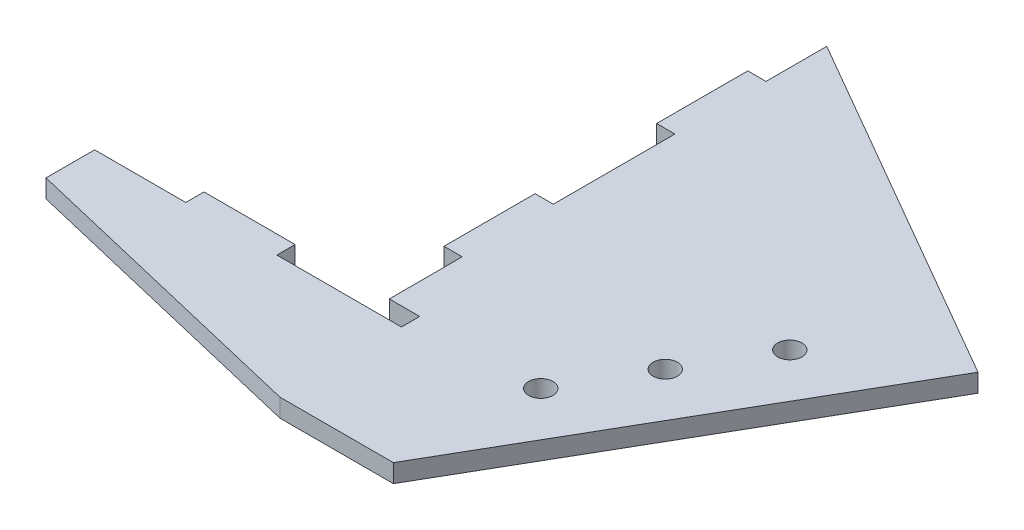
ISO-10303-21;
HEADER;
FILE_DESCRIPTION(('STEP AP214'),'2;1');
FILE_NAME('part.step','',(''),(''),'','','');
FILE_SCHEMA(('AUTOMOTIVE_DESIGN { 1 0 10303 214 1 1 1 1 }'));
ENDSEC;
DATA;
#1=APPLICATION_CONTEXT('core data for automotive mechanical design processes');
#2=APPLICATION_PROTOCOL_DEFINITION('international standard','automotive_design',2000,#1);
#3=PRODUCT_CONTEXT('',#1,'mechanical');
#4=PRODUCT('Part','Part','',(#3));
#5=PRODUCT_RELATED_PRODUCT_CATEGORY('part','',(#4));
#6=PRODUCT_DEFINITION_FORMATION('','',#4);
#7=PRODUCT_DEFINITION_CONTEXT('part definition',#1,'design');
#8=PRODUCT_DEFINITION('design','',#6,#7);
#9=PRODUCT_DEFINITION_SHAPE('','',#8);
#10=(LENGTH_UNIT() NAMED_UNIT(*) SI_UNIT(.MILLI.,.METRE.));
#11=(NAMED_UNIT(*) PLANE_ANGLE_UNIT() SI_UNIT($,.RADIAN.));
#12=(NAMED_UNIT(*) SI_UNIT($,.STERADIAN.) SOLID_ANGLE_UNIT());
#13=UNCERTAINTY_MEASURE_WITH_UNIT(LENGTH_MEASURE(1.E-05),#10,'distance_accuracy_value','');
#14=(GEOMETRIC_REPRESENTATION_CONTEXT(3) GLOBAL_UNCERTAINTY_ASSIGNED_CONTEXT((#13)) GLOBAL_UNIT_ASSIGNED_CONTEXT((#10,
#11,#12)) REPRESENTATION_CONTEXT('',''));
#15=CARTESIAN_POINT('',(0.,0.,0.));
#16=DIRECTION('',(0.,0.,1.));
#17=DIRECTION('',(1.,0.,0.));
#18=AXIS2_PLACEMENT_3D('',#15,#16,#17);
#19=CARTESIAN_POINT('',(-3.33933376635427,3.,14.0530296000742));
#20=DIRECTION('',(0.231186409592624,0.,-0.972909473702292));
#21=DIRECTION('',(-0.972909473702292,0.,-0.231186409592624));
#22=AXIS2_PLACEMENT_3D('',#19,#20,#21);
#23=PLANE('',#22);
#24=DIRECTION('',(0.972909473702292,0.,0.231186409592624));
#25=VECTOR('',#24,1.);
#26=CARTESIAN_POINT('',(-3.33933376635427,0.,14.0530296000742));
#27=LINE('',#26,#25);
#28=CARTESIAN_POINT('',(-22.5,0.,9.5));
#29=VERTEX_POINT('',#28);
#30=CARTESIAN_POINT('',(28.,0.,21.5));
#31=VERTEX_POINT('',#30);
#32=EDGE_CURVE('E277',#29,#31,#27,.T.);
#33=ORIENTED_EDGE('',*,*,#32,.T.);
#34=DIRECTION('',(0.,-1.,0.));
#35=VECTOR('',#34,1.);
#36=CARTESIAN_POINT('',(28.,3.,21.5));
#37=LINE('',#36,#35);
#38=CARTESIAN_POINT('',(28.,3.,21.5));
#39=VERTEX_POINT('',#38);
#40=EDGE_CURVE('E11',#39,#31,#37,.T.);
#41=ORIENTED_EDGE('',*,*,#40,.F.);
#42=DIRECTION('',(0.972909473702292,0.,0.231186409592624));
#43=VECTOR('',#42,1.);
#44=CARTESIAN_POINT('',(-3.33933376635427,3.,14.0530296000742));
#45=LINE('',#44,#43);
#46=CARTESIAN_POINT('',(-22.5,3.,9.5));
#47=VERTEX_POINT('',#46);
#48=EDGE_CURVE('E138',#47,#39,#45,.T.);
#49=ORIENTED_EDGE('',*,*,#48,.F.);
#50=DIRECTION('',(0.,-1.,0.));
#51=VECTOR('',#50,1.);
#52=CARTESIAN_POINT('',(-22.5,3.,9.5));
#53=LINE('',#52,#51);
#54=EDGE_CURVE('E213',#47,#29,#53,.T.);
#55=ORIENTED_EDGE('',*,*,#54,.T.);
#56=EDGE_LOOP('',(#33,#41,#49,#55));
#57=FACE_BOUND('',#56,.T.);
#58=ADVANCED_FACE('F43',(#57),#23,.F.);
#59=CARTESIAN_POINT('',(0.,3.,21.5));
#60=DIRECTION('',(0.,0.,1.));
#61=DIRECTION('',(1.,0.,0.));
#62=AXIS2_PLACEMENT_3D('',#59,#60,#61);
#63=PLANE('',#62);
#64=DIRECTION('',(-1.,0.,0.));
#65=VECTOR('',#64,1.);
#66=CARTESIAN_POINT('',(0.,0.,21.5));
#67=LINE('',#66,#65);
#68=CARTESIAN_POINT('',(46.6713610367752,0.,21.5));
#69=VERTEX_POINT('',#68);
#70=EDGE_CURVE('E281',#69,#31,#67,.T.);
#71=ORIENTED_EDGE('',*,*,#70,.F.);
#72=DIRECTION('',(0.,-1.,0.));
#73=VECTOR('',#72,1.);
#74=CARTESIAN_POINT('',(46.6713610367752,3.,21.5));
#75=LINE('',#74,#73);
#76=CARTESIAN_POINT('',(46.6713610367752,3.,21.5));
#77=VERTEX_POINT('',#76);
#78=EDGE_CURVE('E51',#77,#69,#75,.T.);
#79=ORIENTED_EDGE('',*,*,#78,.F.);
#80=DIRECTION('',(-1.,0.,0.));
#81=VECTOR('',#80,1.);
#82=CARTESIAN_POINT('',(0.,3.,21.5));
#83=LINE('',#82,#81);
#84=EDGE_CURVE('E256',#77,#39,#83,.T.);
#85=ORIENTED_EDGE('',*,*,#84,.T.);
#86=ORIENTED_EDGE('',*,*,#40,.T.);
#87=EDGE_LOOP('',(#71,#79,#85,#86));
#88=FACE_BOUND('',#87,.T.);
#89=ADVANCED_FACE('F372',(#88),#63,.T.);
#90=CARTESIAN_POINT('',(44.3132938682643,3.,25.584292143521));
#91=DIRECTION('',(0.866025403784442,0.,0.499999999999994));
#92=DIRECTION('',(0.499999999999995,0.,-0.866025403784442));
#93=AXIS2_PLACEMENT_3D('',#90,#91,#92);
#94=PLANE('',#93);
#95=DIRECTION('',(-0.499999999999995,0.,0.866025403784442));
#96=VECTOR('',#95,1.);
#97=CARTESIAN_POINT('',(44.3132938682643,0.,25.584292143521));
#98=LINE('',#97,#96);
#99=CARTESIAN_POINT('',(81.889727457342,0.,-39.5000000000003));
#100=VERTEX_POINT('',#99);
#101=EDGE_CURVE('E286',#100,#69,#98,.T.);
#102=ORIENTED_EDGE('',*,*,#101,.F.);
#103=DIRECTION('',(0.,-1.,0.));
#104=VECTOR('',#103,1.);
#105=CARTESIAN_POINT('',(81.889727457342,3.,-39.5000000000003));
#106=LINE('',#105,#104);
#107=CARTESIAN_POINT('',(81.889727457342,3.,-39.5000000000003));
#108=VERTEX_POINT('',#107);
#109=EDGE_CURVE('E365',#108,#100,#106,.T.);
#110=ORIENTED_EDGE('',*,*,#109,.F.);
#111=DIRECTION('',(-0.499999999999995,0.,0.866025403784442));
#112=VECTOR('',#111,1.);
#113=CARTESIAN_POINT('',(44.3132938682643,3.,25.584292143521));
#114=LINE('',#113,#112);
#115=EDGE_CURVE('E253',#108,#77,#114,.T.);
#116=ORIENTED_EDGE('',*,*,#115,.T.);
#117=ORIENTED_EDGE('',*,*,#78,.T.);
#118=EDGE_LOOP('',(#102,#110,#116,#117));
#119=FACE_BOUND('',#118,.T.);
#120=ADVANCED_FACE('F369',(#119),#94,.T.);
#121=CARTESIAN_POINT('',(37.5764335890778,3.,-65.0842921435214));
#122=DIRECTION('',(0.499999999999995,0.,-0.866025403784442));
#123=DIRECTION('',(-0.866025403784442,0.,-0.499999999999995));
#124=AXIS2_PLACEMENT_3D('',#121,#122,#123);
#125=PLANE('',#124);
#126=DIRECTION('',(0.866025403784442,0.,0.499999999999995));
#127=VECTOR('',#126,1.);
#128=CARTESIAN_POINT('',(37.5764335890778,0.,-65.0842921435214));
#129=LINE('',#128,#127);
#130=CARTESIAN_POINT('',(23.,0.,-73.5));
#131=VERTEX_POINT('',#130);
#132=EDGE_CURVE('E291',#131,#100,#129,.T.);
#133=ORIENTED_EDGE('',*,*,#132,.F.);
#134=DIRECTION('',(0.,-1.,0.));
#135=VECTOR('',#134,1.);
#136=CARTESIAN_POINT('',(23.,3.,-73.5));
#137=LINE('',#136,#135);
#138=CARTESIAN_POINT('',(23.,3.,-73.5));
#139=VERTEX_POINT('',#138);
#140=EDGE_CURVE('E363',#139,#131,#137,.T.);
#141=ORIENTED_EDGE('',*,*,#140,.F.);
#142=DIRECTION('',(0.866025403784442,0.,0.499999999999995));
#143=VECTOR('',#142,1.);
#144=CARTESIAN_POINT('',(37.5764335890778,3.,-65.0842921435214));
#145=LINE('',#144,#143);
#146=EDGE_CURVE('E250',#139,#108,#145,.T.);
#147=ORIENTED_EDGE('',*,*,#146,.T.);
#148=ORIENTED_EDGE('',*,*,#109,.T.);
#149=EDGE_LOOP('',(#133,#141,#147,#148));
#150=FACE_BOUND('',#149,.T.);
#151=ADVANCED_FACE('F379',(#150),#125,.T.);
#152=CARTESIAN_POINT('',(23.,3.,0.));
#153=DIRECTION('',(-1.,0.,0.));
#154=DIRECTION('',(0.,0.,1.));
#155=AXIS2_PLACEMENT_3D('',#152,#153,#154);
#156=PLANE('',#155);
#157=DIRECTION('',(0.,0.,-1.));
#158=VECTOR('',#157,1.);
#159=CARTESIAN_POINT('',(23.,0.,0.));
#160=LINE('',#159,#158);
#161=CARTESIAN_POINT('',(23.,0.,-63.5));
#162=VERTEX_POINT('',#161);
#163=EDGE_CURVE('E294',#162,#131,#160,.T.);
#164=ORIENTED_EDGE('',*,*,#163,.F.);
#165=DIRECTION('',(0.,-1.,0.));
#166=VECTOR('',#165,1.);
#167=CARTESIAN_POINT('',(23.,3.,-63.5));
#168=LINE('',#167,#166);
#169=CARTESIAN_POINT('',(23.,3.,-63.5));
#170=VERTEX_POINT('',#169);
#171=EDGE_CURVE('E361',#170,#162,#168,.T.);
#172=ORIENTED_EDGE('',*,*,#171,.F.);
#173=DIRECTION('',(0.,0.,-1.));
#174=VECTOR('',#173,1.);
#175=CARTESIAN_POINT('',(23.,3.,0.));
#176=LINE('',#175,#174);
#177=EDGE_CURVE('E247',#170,#139,#176,.T.);
#178=ORIENTED_EDGE('',*,*,#177,.T.);
#179=ORIENTED_EDGE('',*,*,#140,.T.);
#180=EDGE_LOOP('',(#164,#172,#178,#179));
#181=FACE_BOUND('',#180,.T.);
#182=ADVANCED_FACE('F383',(#181),#156,.T.);
#183=CARTESIAN_POINT('',(0.,3.,-63.5));
#184=DIRECTION('',(0.,0.,1.));
#185=DIRECTION('',(1.,0.,0.));
#186=AXIS2_PLACEMENT_3D('',#183,#184,#185);
#187=PLANE('',#186);
#188=DIRECTION('',(-1.,0.,0.));
#189=VECTOR('',#188,1.);
#190=CARTESIAN_POINT('',(0.,0.,-63.5));
#191=LINE('',#190,#189);
#192=CARTESIAN_POINT('',(20.,0.,-63.5));
#193=VERTEX_POINT('',#192);
#194=EDGE_CURVE('E297',#162,#193,#191,.T.);
#195=ORIENTED_EDGE('',*,*,#194,.T.);
#196=DIRECTION('',(0.,-1.,0.));
#197=VECTOR('',#196,1.);
#198=CARTESIAN_POINT('',(20.,3.,-63.5));
#199=LINE('',#198,#197);
#200=CARTESIAN_POINT('',(20.,3.,-63.5));
#201=VERTEX_POINT('',#200);
#202=EDGE_CURVE('E359',#201,#193,#199,.T.);
#203=ORIENTED_EDGE('',*,*,#202,.F.);
#204=DIRECTION('',(-1.,0.,0.));
#205=VECTOR('',#204,1.);
#206=CARTESIAN_POINT('',(0.,3.,-63.5));
#207=LINE('',#206,#205);
#208=EDGE_CURVE('E245',#170,#201,#207,.T.);
#209=ORIENTED_EDGE('',*,*,#208,.F.);
#210=ORIENTED_EDGE('',*,*,#171,.T.);
#211=EDGE_LOOP('',(#195,#203,#209,#210));
#212=FACE_BOUND('',#211,.T.);
#213=ADVANCED_FACE('F387',(#212),#187,.F.);
#214=CARTESIAN_POINT('',(20.,3.,0.));
#215=DIRECTION('',(-1.,0.,0.));
#216=DIRECTION('',(0.,0.,1.));
#217=AXIS2_PLACEMENT_3D('',#214,#215,#216);
#218=PLANE('',#217);
#219=DIRECTION('',(0.,0.,-1.));
#220=VECTOR('',#219,1.);
#221=CARTESIAN_POINT('',(20.,0.,0.));
#222=LINE('',#221,#220);
#223=CARTESIAN_POINT('',(20.,0.,-48.5));
#224=VERTEX_POINT('',#223);
#225=EDGE_CURVE('E302',#224,#193,#222,.T.);
#226=ORIENTED_EDGE('',*,*,#225,.F.);
#227=DIRECTION('',(0.,-1.,0.));
#228=VECTOR('',#227,1.);
#229=CARTESIAN_POINT('',(20.,3.,-48.5));
#230=LINE('',#229,#228);
#231=CARTESIAN_POINT('',(20.,3.,-48.5));
#232=VERTEX_POINT('',#231);
#233=EDGE_CURVE('E357',#232,#224,#230,.T.);
#234=ORIENTED_EDGE('',*,*,#233,.F.);
#235=DIRECTION('',(0.,0.,-1.));
#236=VECTOR('',#235,1.);
#237=CARTESIAN_POINT('',(20.,3.,0.));
#238=LINE('',#237,#236);
#239=EDGE_CURVE('E242',#232,#201,#238,.T.);
#240=ORIENTED_EDGE('',*,*,#239,.T.);
#241=ORIENTED_EDGE('',*,*,#202,.T.);
#242=EDGE_LOOP('',(#226,#234,#240,#241));
#243=FACE_BOUND('',#242,.T.);
#244=ADVANCED_FACE('F448',(#243),#218,.T.);
#245=CARTESIAN_POINT('',(0.,3.,-48.5));
#246=DIRECTION('',(0.,0.,1.));
#247=DIRECTION('',(1.,0.,0.));
#248=AXIS2_PLACEMENT_3D('',#245,#246,#247);
#249=PLANE('',#248);
#250=DIRECTION('',(-1.,0.,0.));
#251=VECTOR('',#250,1.);
#252=CARTESIAN_POINT('',(0.,0.,-48.5));
#253=LINE('',#252,#251);
#254=CARTESIAN_POINT('',(23.,0.,-48.5));
#255=VERTEX_POINT('',#254);
#256=EDGE_CURVE('E305',#255,#224,#253,.T.);
#257=ORIENTED_EDGE('',*,*,#256,.F.);
#258=DIRECTION('',(0.,-1.,0.));
#259=VECTOR('',#258,1.);
#260=CARTESIAN_POINT('',(23.,3.,-48.5));
#261=LINE('',#260,#259);
#262=CARTESIAN_POINT('',(23.,3.,-48.5));
#263=VERTEX_POINT('',#262);
#264=EDGE_CURVE('E355',#263,#255,#261,.T.);
#265=ORIENTED_EDGE('',*,*,#264,.F.);
#266=DIRECTION('',(-1.,0.,0.));
#267=VECTOR('',#266,1.);
#268=CARTESIAN_POINT('',(0.,3.,-48.5));
#269=LINE('',#268,#267);
#270=EDGE_CURVE('E239',#263,#232,#269,.T.);
#271=ORIENTED_EDGE('',*,*,#270,.T.);
#272=ORIENTED_EDGE('',*,*,#233,.T.);
#273=EDGE_LOOP('',(#257,#265,#271,#272));
#274=FACE_BOUND('',#273,.T.);
#275=ADVANCED_FACE('F395',(#274),#249,.T.);
#276=CARTESIAN_POINT('',(23.,0.,-28.5));
#277=VERTEX_POINT('',#276);
#278=EDGE_CURVE('E299',#277,#255,#160,.T.);
#279=ORIENTED_EDGE('',*,*,#278,.F.);
#280=DIRECTION('',(0.,-1.,0.));
#281=VECTOR('',#280,1.);
#282=CARTESIAN_POINT('',(23.,3.,-28.5));
#283=LINE('',#282,#281);
#284=CARTESIAN_POINT('',(23.,3.,-28.5));
#285=VERTEX_POINT('',#284);
#286=EDGE_CURVE('E353',#285,#277,#283,.T.);
#287=ORIENTED_EDGE('',*,*,#286,.F.);
#288=EDGE_CURVE('E238',#285,#263,#176,.T.);
#289=ORIENTED_EDGE('',*,*,#288,.T.);
#290=ORIENTED_EDGE('',*,*,#264,.T.);
#291=EDGE_LOOP('',(#279,#287,#289,#290));
#292=FACE_BOUND('',#291,.T.);
#293=ADVANCED_FACE('F400',(#292),#156,.T.);
#294=CARTESIAN_POINT('',(0.,3.,-28.5));
#295=DIRECTION('',(0.,0.,1.));
#296=DIRECTION('',(1.,0.,0.));
#297=AXIS2_PLACEMENT_3D('',#294,#295,#296);
#298=PLANE('',#297);
#299=DIRECTION('',(-1.,0.,0.));
#300=VECTOR('',#299,1.);
#301=CARTESIAN_POINT('',(0.,0.,-28.5));
#302=LINE('',#301,#300);
#303=CARTESIAN_POINT('',(20.,0.,-28.5));
#304=VERTEX_POINT('',#303);
#305=EDGE_CURVE('E308',#277,#304,#302,.T.);
#306=ORIENTED_EDGE('',*,*,#305,.T.);
#307=DIRECTION('',(0.,-1.,0.));
#308=VECTOR('',#307,1.);
#309=CARTESIAN_POINT('',(20.,3.,-28.5));
#310=LINE('',#309,#308);
#311=CARTESIAN_POINT('',(20.,3.,-28.5));
#312=VERTEX_POINT('',#311);
#313=EDGE_CURVE('E351',#312,#304,#310,.T.);
#314=ORIENTED_EDGE('',*,*,#313,.F.);
#315=DIRECTION('',(-1.,0.,0.));
#316=VECTOR('',#315,1.);
#317=CARTESIAN_POINT('',(0.,3.,-28.5));
#318=LINE('',#317,#316);
#319=EDGE_CURVE('E236',#285,#312,#318,.T.);
#320=ORIENTED_EDGE('',*,*,#319,.F.);
#321=ORIENTED_EDGE('',*,*,#286,.T.);
#322=EDGE_LOOP('',(#306,#314,#320,#321));
#323=FACE_BOUND('',#322,.T.);
#324=ADVANCED_FACE('F453',(#323),#298,.F.);
#325=CARTESIAN_POINT('',(20.,3.,0.));
#326=DIRECTION('',(-1.,0.,0.));
#327=DIRECTION('',(0.,0.,1.));
#328=AXIS2_PLACEMENT_3D('',#325,#326,#327);
#329=PLANE('',#328);
#330=DIRECTION('',(0.,0.,-1.));
#331=VECTOR('',#330,1.);
#332=CARTESIAN_POINT('',(20.,0.,0.));
#333=LINE('',#332,#331);
#334=CARTESIAN_POINT('',(20.,0.,-13.5));
#335=VERTEX_POINT('',#334);
#336=EDGE_CURVE('E311',#335,#304,#333,.T.);
#337=ORIENTED_EDGE('',*,*,#336,.F.);
#338=DIRECTION('',(0.,-1.,0.));
#339=VECTOR('',#338,1.);
#340=CARTESIAN_POINT('',(20.,3.,-13.5));
#341=LINE('',#340,#339);
#342=CARTESIAN_POINT('',(20.,3.,-13.5));
#343=VERTEX_POINT('',#342);
#344=EDGE_CURVE('E349',#343,#335,#341,.T.);
#345=ORIENTED_EDGE('',*,*,#344,.F.);
#346=DIRECTION('',(0.,0.,-1.));
#347=VECTOR('',#346,1.);
#348=CARTESIAN_POINT('',(20.,3.,0.));
#349=LINE('',#348,#347);
#350=EDGE_CURVE('E233',#343,#312,#349,.T.);
#351=ORIENTED_EDGE('',*,*,#350,.T.);
#352=ORIENTED_EDGE('',*,*,#313,.T.);
#353=EDGE_LOOP('',(#337,#345,#351,#352));
#354=FACE_BOUND('',#353,.T.);
#355=ADVANCED_FACE('F456',(#354),#329,.T.);
#356=CARTESIAN_POINT('',(0.,3.,-13.5));
#357=DIRECTION('',(0.,0.,1.));
#358=DIRECTION('',(1.,0.,0.));
#359=AXIS2_PLACEMENT_3D('',#356,#357,#358);
#360=PLANE('',#359);
#361=DIRECTION('',(-1.,0.,0.));
#362=VECTOR('',#361,1.);
#363=CARTESIAN_POINT('',(0.,0.,-13.5));
#364=LINE('',#363,#362);
#365=CARTESIAN_POINT('',(23.,0.,-13.5));
#366=VERTEX_POINT('',#365);
#367=EDGE_CURVE('E314',#366,#335,#364,.T.);
#368=ORIENTED_EDGE('',*,*,#367,.F.);
#369=DIRECTION('',(0.,-1.,0.));
#370=VECTOR('',#369,1.);
#371=CARTESIAN_POINT('',(23.,3.,-13.5));
#372=LINE('',#371,#370);
#373=CARTESIAN_POINT('',(23.,3.,-13.5));
#374=VERTEX_POINT('',#373);
#375=EDGE_CURVE('E347',#374,#366,#372,.T.);
#376=ORIENTED_EDGE('',*,*,#375,.F.);
#377=DIRECTION('',(-1.,0.,0.));
#378=VECTOR('',#377,1.);
#379=CARTESIAN_POINT('',(0.,3.,-13.5));
#380=LINE('',#379,#378);
#381=EDGE_CURVE('E230',#374,#343,#380,.T.);
#382=ORIENTED_EDGE('',*,*,#381,.T.);
#383=ORIENTED_EDGE('',*,*,#344,.T.);
#384=EDGE_LOOP('',(#368,#376,#382,#383));
#385=FACE_BOUND('',#384,.T.);
#386=ADVANCED_FACE('F460',(#385),#360,.T.);
#387=CARTESIAN_POINT('',(23.,0.,-1.5));
#388=VERTEX_POINT('',#387);
#389=EDGE_CURVE('E298',#388,#366,#160,.T.);
#390=ORIENTED_EDGE('',*,*,#389,.F.);
#391=DIRECTION('',(0.,-1.,0.));
#392=VECTOR('',#391,1.);
#393=CARTESIAN_POINT('',(23.,3.,-1.5));
#394=LINE('',#393,#392);
#395=CARTESIAN_POINT('',(23.,3.,-1.5));
#396=VERTEX_POINT('',#395);
#397=EDGE_CURVE('E345',#396,#388,#394,.T.);
#398=ORIENTED_EDGE('',*,*,#397,.F.);
#399=EDGE_CURVE('E227',#396,#374,#176,.T.);
#400=ORIENTED_EDGE('',*,*,#399,.T.);
#401=ORIENTED_EDGE('',*,*,#375,.T.);
#402=EDGE_LOOP('',(#390,#398,#400,#401));
#403=FACE_BOUND('',#402,.T.);
#404=ADVANCED_FACE('F406',(#403),#156,.T.);
#405=CARTESIAN_POINT('',(0.,3.,-1.5));
#406=DIRECTION('',(0.,0.,1.));
#407=DIRECTION('',(1.,0.,0.));
#408=AXIS2_PLACEMENT_3D('',#405,#406,#407);
#409=PLANE('',#408);
#410=DIRECTION('',(-1.,0.,0.));
#411=VECTOR('',#410,1.);
#412=CARTESIAN_POINT('',(0.,0.,-1.5));
#413=LINE('',#412,#411);
#414=CARTESIAN_POINT('',(28.,0.,-1.5));
#415=VERTEX_POINT('',#414);
#416=EDGE_CURVE('E317',#415,#388,#413,.T.);
#417=ORIENTED_EDGE('',*,*,#416,.F.);
#418=DIRECTION('',(0.,-1.,0.));
#419=VECTOR('',#418,1.);
#420=CARTESIAN_POINT('',(28.,3.,-1.5));
#421=LINE('',#420,#419);
#422=CARTESIAN_POINT('',(28.,3.,-1.5));
#423=VERTEX_POINT('',#422);
#424=EDGE_CURVE('E343',#423,#415,#421,.T.);
#425=ORIENTED_EDGE('',*,*,#424,.F.);
#426=DIRECTION('',(-1.,0.,0.));
#427=VECTOR('',#426,1.);
#428=CARTESIAN_POINT('',(0.,3.,-1.5));
#429=LINE('',#428,#427);
#430=EDGE_CURVE('E224',#423,#396,#429,.T.);
#431=ORIENTED_EDGE('',*,*,#430,.T.);
#432=ORIENTED_EDGE('',*,*,#397,.T.);
#433=EDGE_LOOP('',(#417,#425,#431,#432));
#434=FACE_BOUND('',#433,.T.);
#435=ADVANCED_FACE('F413',(#434),#409,.T.);
#436=CARTESIAN_POINT('',(28.,3.,0.));
#437=DIRECTION('',(-1.,0.,0.));
#438=DIRECTION('',(0.,0.,1.));
#439=AXIS2_PLACEMENT_3D('',#436,#437,#438);
#440=PLANE('',#439);
#441=DIRECTION('',(0.,0.,-1.));
#442=VECTOR('',#441,1.);
#443=CARTESIAN_POINT('',(28.,0.,0.));
#444=LINE('',#443,#442);
#445=CARTESIAN_POINT('',(28.,0.,1.5));
#446=VERTEX_POINT('',#445);
#447=EDGE_CURVE('E320',#446,#415,#444,.T.);
#448=ORIENTED_EDGE('',*,*,#447,.F.);
#449=DIRECTION('',(0.,-1.,0.));
#450=VECTOR('',#449,1.);
#451=CARTESIAN_POINT('',(28.,3.,1.5));
#452=LINE('',#451,#450);
#453=CARTESIAN_POINT('',(28.,3.,1.5));
#454=VERTEX_POINT('',#453);
#455=EDGE_CURVE('E341',#454,#446,#452,.T.);
#456=ORIENTED_EDGE('',*,*,#455,.F.);
#457=DIRECTION('',(0.,0.,-1.));
#458=VECTOR('',#457,1.);
#459=CARTESIAN_POINT('',(28.,3.,0.));
#460=LINE('',#459,#458);
#461=EDGE_CURVE('E218',#454,#423,#460,.T.);
#462=ORIENTED_EDGE('',*,*,#461,.T.);
#463=ORIENTED_EDGE('',*,*,#424,.T.);
#464=EDGE_LOOP('',(#448,#456,#462,#463));
#465=FACE_BOUND('',#464,.T.);
#466=ADVANCED_FACE('F415',(#465),#440,.T.);
#467=CARTESIAN_POINT('',(0.,3.,1.5));
#468=DIRECTION('',(0.,0.,1.));
#469=DIRECTION('',(1.,0.,0.));
#470=AXIS2_PLACEMENT_3D('',#467,#468,#469);
#471=PLANE('',#470);
#472=DIRECTION('',(-1.,0.,0.));
#473=VECTOR('',#472,1.);
#474=CARTESIAN_POINT('',(0.,0.,1.5));
#475=LINE('',#474,#473);
#476=CARTESIAN_POINT('',(7.5,0.,1.5));
#477=VERTEX_POINT('',#476);
#478=EDGE_CURVE('E323',#446,#477,#475,.T.);
#479=ORIENTED_EDGE('',*,*,#478,.T.);
#480=DIRECTION('',(0.,-1.,0.));
#481=VECTOR('',#480,1.);
#482=CARTESIAN_POINT('',(7.5,3.,1.5));
#483=LINE('',#482,#481);
#484=CARTESIAN_POINT('',(7.5,3.,1.5));
#485=VERTEX_POINT('',#484);
#486=EDGE_CURVE('E339',#485,#477,#483,.T.);
#487=ORIENTED_EDGE('',*,*,#486,.F.);
#488=DIRECTION('',(-1.,0.,0.));
#489=VECTOR('',#488,1.);
#490=CARTESIAN_POINT('',(0.,3.,1.5));
#491=LINE('',#490,#489);
#492=EDGE_CURVE('E212',#454,#485,#491,.T.);
#493=ORIENTED_EDGE('',*,*,#492,.F.);
#494=ORIENTED_EDGE('',*,*,#455,.T.);
#495=EDGE_LOOP('',(#479,#487,#493,#494));
#496=FACE_BOUND('',#495,.T.);
#497=ADVANCED_FACE('F420',(#496),#471,.F.);
#498=CARTESIAN_POINT('',(7.5,3.,0.));
#499=DIRECTION('',(1.,0.,0.));
#500=DIRECTION('',(0.,0.,-1.));
#501=AXIS2_PLACEMENT_3D('',#498,#499,#500);
#502=PLANE('',#501);
#503=DIRECTION('',(0.,0.,1.));
#504=VECTOR('',#503,1.);
#505=CARTESIAN_POINT('',(7.5,0.,0.));
#506=LINE('',#505,#504);
#507=CARTESIAN_POINT('',(7.5,0.,-1.5));
#508=VERTEX_POINT('',#507);
#509=EDGE_CURVE('E326',#508,#477,#506,.T.);
#510=ORIENTED_EDGE('',*,*,#509,.F.);
#511=DIRECTION('',(0.,-1.,0.));
#512=VECTOR('',#511,1.);
#513=CARTESIAN_POINT('',(7.5,3.,-1.5));
#514=LINE('',#513,#512);
#515=CARTESIAN_POINT('',(7.5,3.,-1.5));
#516=VERTEX_POINT('',#515);
#517=EDGE_CURVE('E337',#516,#508,#514,.T.);
#518=ORIENTED_EDGE('',*,*,#517,.F.);
#519=DIRECTION('',(0.,0.,1.));
#520=VECTOR('',#519,1.);
#521=CARTESIAN_POINT('',(7.5,3.,0.));
#522=LINE('',#521,#520);
#523=EDGE_CURVE('E217',#516,#485,#522,.T.);
#524=ORIENTED_EDGE('',*,*,#523,.T.);
#525=ORIENTED_EDGE('',*,*,#486,.T.);
#526=EDGE_LOOP('',(#510,#518,#524,#525));
#527=FACE_BOUND('',#526,.T.);
#528=ADVANCED_FACE('F422',(#527),#502,.T.);
#529=CARTESIAN_POINT('',(0.,3.,-1.5));
#530=DIRECTION('',(0.,0.,-1.));
#531=DIRECTION('',(-1.,0.,0.));
#532=AXIS2_PLACEMENT_3D('',#529,#530,#531);
#533=PLANE('',#532);
#534=DIRECTION('',(1.,0.,0.));
#535=VECTOR('',#534,1.);
#536=CARTESIAN_POINT('',(0.,0.,-1.5));
#537=LINE('',#536,#535);
#538=CARTESIAN_POINT('',(-7.5,0.,-1.5));
#539=VERTEX_POINT('',#538);
#540=EDGE_CURVE('E329',#539,#508,#537,.T.);
#541=ORIENTED_EDGE('',*,*,#540,.F.);
#542=DIRECTION('',(0.,-1.,0.));
#543=VECTOR('',#542,1.);
#544=CARTESIAN_POINT('',(-7.5,3.,-1.5));
#545=LINE('',#544,#543);
#546=CARTESIAN_POINT('',(-7.5,3.,-1.5));
#547=VERTEX_POINT('',#546);
#548=EDGE_CURVE('E207',#547,#539,#545,.T.);
#549=ORIENTED_EDGE('',*,*,#548,.F.);
#550=DIRECTION('',(1.,0.,0.));
#551=VECTOR('',#550,1.);
#552=CARTESIAN_POINT('',(0.,3.,-1.5));
#553=LINE('',#552,#551);
#554=EDGE_CURVE('E200',#547,#516,#553,.T.);
#555=ORIENTED_EDGE('',*,*,#554,.T.);
#556=ORIENTED_EDGE('',*,*,#517,.T.);
#557=EDGE_LOOP('',(#541,#549,#555,#556));
#558=FACE_BOUND('',#557,.T.);
#559=ADVANCED_FACE('F425',(#558),#533,.T.);
#560=CARTESIAN_POINT('',(-7.5,3.,0.));
#561=DIRECTION('',(1.,0.,0.));
#562=DIRECTION('',(0.,0.,-1.));
#563=AXIS2_PLACEMENT_3D('',#560,#561,#562);
#564=PLANE('',#563);
#565=DIRECTION('',(0.,0.,1.));
#566=VECTOR('',#565,1.);
#567=CARTESIAN_POINT('',(-7.5,0.,0.));
#568=LINE('',#567,#566);
#569=CARTESIAN_POINT('',(-7.5,0.,1.5));
#570=VERTEX_POINT('',#569);
#571=EDGE_CURVE('E206',#539,#570,#568,.T.);
#572=ORIENTED_EDGE('',*,*,#571,.T.);
#573=DIRECTION('',(0.,-1.,0.));
#574=VECTOR('',#573,1.);
#575=CARTESIAN_POINT('',(-7.5,3.,1.5));
#576=LINE('',#575,#574);
#577=CARTESIAN_POINT('',(-7.5,3.,1.5));
#578=VERTEX_POINT('',#577);
#579=EDGE_CURVE('E203',#578,#570,#576,.T.);
#580=ORIENTED_EDGE('',*,*,#579,.F.);
#581=DIRECTION('',(0.,0.,1.));
#582=VECTOR('',#581,1.);
#583=CARTESIAN_POINT('',(-7.5,3.,0.));
#584=LINE('',#583,#582);
#585=EDGE_CURVE('E193',#547,#578,#584,.T.);
#586=ORIENTED_EDGE('',*,*,#585,.F.);
#587=ORIENTED_EDGE('',*,*,#548,.T.);
#588=EDGE_LOOP('',(#572,#580,#586,#587));
#589=FACE_BOUND('',#588,.T.);
#590=ADVANCED_FACE('F204',(#589),#564,.F.);
#591=CARTESIAN_POINT('',(-22.5,0.,1.5));
#592=VERTEX_POINT('',#591);
#593=EDGE_CURVE('E126',#570,#592,#475,.T.);
#594=ORIENTED_EDGE('',*,*,#593,.T.);
#595=DIRECTION('',(0.,-1.,0.));
#596=VECTOR('',#595,1.);
#597=CARTESIAN_POINT('',(-22.5,3.,1.5));
#598=LINE('',#597,#596);
#599=CARTESIAN_POINT('',(-22.5,3.,1.5));
#600=VERTEX_POINT('',#599);
#601=EDGE_CURVE('E208',#600,#592,#598,.T.);
#602=ORIENTED_EDGE('',*,*,#601,.F.);
#603=EDGE_CURVE('E197',#578,#600,#491,.T.);
#604=ORIENTED_EDGE('',*,*,#603,.F.);
#605=ORIENTED_EDGE('',*,*,#579,.T.);
#606=EDGE_LOOP('',(#594,#602,#604,#605));
#607=FACE_BOUND('',#606,.T.);
#608=ADVANCED_FACE('F210',(#607),#471,.F.);
#609=CARTESIAN_POINT('',(-22.5,3.,0.));
#610=DIRECTION('',(1.,0.,0.));
#611=DIRECTION('',(0.,0.,-1.));
#612=AXIS2_PLACEMENT_3D('',#609,#610,#611);
#613=PLANE('',#612);
#614=DIRECTION('',(0.,0.,1.));
#615=VECTOR('',#614,1.);
#616=CARTESIAN_POINT('',(-22.5,0.,0.));
#617=LINE('',#616,#615);
#618=EDGE_CURVE('E132',#592,#29,#617,.T.);
#619=ORIENTED_EDGE('',*,*,#618,.T.);
#620=ORIENTED_EDGE('',*,*,#54,.F.);
#621=DIRECTION('',(0.,0.,1.));
#622=VECTOR('',#621,1.);
#623=CARTESIAN_POINT('',(-22.5,3.,0.));
#624=LINE('',#623,#622);
#625=EDGE_CURVE('E59',#600,#47,#624,.T.);
#626=ORIENTED_EDGE('',*,*,#625,.F.);
#627=ORIENTED_EDGE('',*,*,#601,.T.);
#628=EDGE_LOOP('',(#619,#620,#626,#627));
#629=FACE_BOUND('',#628,.T.);
#630=ADVANCED_FACE('F478',(#629),#613,.F.);
#631=CARTESIAN_POINT('',(0.,3.,0.));
#632=DIRECTION('',(0.,1.,0.));
#633=DIRECTION('',(0.,0.,1.));
#634=AXIS2_PLACEMENT_3D('',#631,#632,#633);
#635=PLANE('',#634);
#636=CARTESIAN_POINT('',(63.2294734194975,3.,-27.1794919243112));
#637=DIRECTION('',(0.,1.,0.));
#638=DIRECTION('',(0.,0.,1.));
#639=AXIS2_PLACEMENT_3D('',#636,#637,#638);
#640=CIRCLE('',#639,1.99999999999998);
#641=CARTESIAN_POINT('',(63.2294734194975,3.,-25.1794919243112));
#642=VERTEX_POINT('',#641);
#643=EDGE_CURVE('E272',#642,#642,#640,.T.);
#644=ORIENTED_EDGE('',*,*,#643,.F.);
#645=EDGE_LOOP('',(#644));
#646=FACE_BOUND('',#645,.T.);
#647=CARTESIAN_POINT('',(55.7294734194975,3.,-14.1891108675446));
#648=DIRECTION('',(0.,1.,0.));
#649=DIRECTION('',(0.,0.,1.));
#650=AXIS2_PLACEMENT_3D('',#647,#648,#649);
#651=CIRCLE('',#650,2.);
#652=CARTESIAN_POINT('',(55.7294734194975,3.,-12.1891108675446));
#653=VERTEX_POINT('',#652);
#654=EDGE_CURVE('E269',#653,#653,#651,.T.);
#655=ORIENTED_EDGE('',*,*,#654,.F.);
#656=EDGE_LOOP('',(#655));
#657=FACE_BOUND('',#656,.T.);
#658=CARTESIAN_POINT('',(48.2294734194976,3.,-1.19872981077795));
#659=DIRECTION('',(0.,1.,0.));
#660=DIRECTION('',(0.,0.,1.));
#661=AXIS2_PLACEMENT_3D('',#658,#659,#660);
#662=CIRCLE('',#661,2.);
#663=CARTESIAN_POINT('',(48.2294734194976,3.,0.801270189222045));
#664=VERTEX_POINT('',#663);
#665=EDGE_CURVE('E263',#664,#664,#662,.T.);
#666=ORIENTED_EDGE('',*,*,#665,.F.);
#667=EDGE_LOOP('',(#666));
#668=FACE_BOUND('',#667,.T.);
#669=ORIENTED_EDGE('',*,*,#48,.T.);
#670=ORIENTED_EDGE('',*,*,#84,.F.);
#671=ORIENTED_EDGE('',*,*,#115,.F.);
#672=ORIENTED_EDGE('',*,*,#146,.F.);
#673=ORIENTED_EDGE('',*,*,#177,.F.);
#674=ORIENTED_EDGE('',*,*,#208,.T.);
#675=ORIENTED_EDGE('',*,*,#239,.F.);
#676=ORIENTED_EDGE('',*,*,#270,.F.);
#677=ORIENTED_EDGE('',*,*,#288,.F.);
#678=ORIENTED_EDGE('',*,*,#319,.T.);
#679=ORIENTED_EDGE('',*,*,#350,.F.);
#680=ORIENTED_EDGE('',*,*,#381,.F.);
#681=ORIENTED_EDGE('',*,*,#399,.F.);
#682=ORIENTED_EDGE('',*,*,#430,.F.);
#683=ORIENTED_EDGE('',*,*,#461,.F.);
#684=ORIENTED_EDGE('',*,*,#492,.T.);
#685=ORIENTED_EDGE('',*,*,#523,.F.);
#686=ORIENTED_EDGE('',*,*,#554,.F.);
#687=ORIENTED_EDGE('',*,*,#585,.T.);
#688=ORIENTED_EDGE('',*,*,#603,.T.);
#689=ORIENTED_EDGE('',*,*,#625,.T.);
#690=EDGE_LOOP('',(#669,#670,#671,#672,#673,#674,#675,#676,#677,#678,#679,#680,#681,#682,#683,
#684,#685,#686,#687,#688,#689));
#691=FACE_BOUND('',#690,.T.);
#692=ADVANCED_FACE('F195',(#646,#657,#668,#691),#635,.T.);
#693=CARTESIAN_POINT('',(0.,0.,0.));
#694=DIRECTION('',(0.,1.,0.));
#695=DIRECTION('',(0.,0.,1.));
#696=AXIS2_PLACEMENT_3D('',#693,#694,#695);
#697=PLANE('',#696);
#698=CARTESIAN_POINT('',(63.2294734194975,0.,-27.1794919243112));
#699=DIRECTION('',(0.,1.,0.));
#700=DIRECTION('',(0.,0.,1.));
#701=AXIS2_PLACEMENT_3D('',#698,#699,#700);
#702=CIRCLE('',#701,1.99999999999998);
#703=CARTESIAN_POINT('',(63.2294734194975,0.,-25.1794919243112));
#704=VERTEX_POINT('',#703);
#705=EDGE_CURVE('E275',#704,#704,#702,.T.);
#706=ORIENTED_EDGE('',*,*,#705,.T.);
#707=EDGE_LOOP('',(#706));
#708=FACE_BOUND('',#707,.T.);
#709=CARTESIAN_POINT('',(55.7294734194975,0.,-14.1891108675446));
#710=DIRECTION('',(0.,1.,0.));
#711=DIRECTION('',(0.,0.,1.));
#712=AXIS2_PLACEMENT_3D('',#709,#710,#711);
#713=CIRCLE('',#712,2.);
#714=CARTESIAN_POINT('',(55.7294734194975,0.,-12.1891108675446));
#715=VERTEX_POINT('',#714);
#716=EDGE_CURVE('E266',#715,#715,#713,.T.);
#717=ORIENTED_EDGE('',*,*,#716,.T.);
#718=EDGE_LOOP('',(#717));
#719=FACE_BOUND('',#718,.T.);
#720=CARTESIAN_POINT('',(48.2294734194976,0.,-1.19872981077795));
#721=DIRECTION('',(0.,1.,0.));
#722=DIRECTION('',(0.,0.,1.));
#723=AXIS2_PLACEMENT_3D('',#720,#721,#722);
#724=CIRCLE('',#723,2.);
#725=CARTESIAN_POINT('',(48.2294734194976,0.,0.801270189222045));
#726=VERTEX_POINT('',#725);
#727=EDGE_CURVE('E260',#726,#726,#724,.T.);
#728=ORIENTED_EDGE('',*,*,#727,.T.);
#729=EDGE_LOOP('',(#728));
#730=FACE_BOUND('',#729,.T.);
#731=ORIENTED_EDGE('',*,*,#32,.F.);
#732=ORIENTED_EDGE('',*,*,#618,.F.);
#733=ORIENTED_EDGE('',*,*,#593,.F.);
#734=ORIENTED_EDGE('',*,*,#571,.F.);
#735=ORIENTED_EDGE('',*,*,#540,.T.);
#736=ORIENTED_EDGE('',*,*,#509,.T.);
#737=ORIENTED_EDGE('',*,*,#478,.F.);
#738=ORIENTED_EDGE('',*,*,#447,.T.);
#739=ORIENTED_EDGE('',*,*,#416,.T.);
#740=ORIENTED_EDGE('',*,*,#389,.T.);
#741=ORIENTED_EDGE('',*,*,#367,.T.);
#742=ORIENTED_EDGE('',*,*,#336,.T.);
#743=ORIENTED_EDGE('',*,*,#305,.F.);
#744=ORIENTED_EDGE('',*,*,#278,.T.);
#745=ORIENTED_EDGE('',*,*,#256,.T.);
#746=ORIENTED_EDGE('',*,*,#225,.T.);
#747=ORIENTED_EDGE('',*,*,#194,.F.);
#748=ORIENTED_EDGE('',*,*,#163,.T.);
#749=ORIENTED_EDGE('',*,*,#132,.T.);
#750=ORIENTED_EDGE('',*,*,#101,.T.);
#751=ORIENTED_EDGE('',*,*,#70,.T.);
#752=EDGE_LOOP('',(#731,#732,#733,#734,#735,#736,#737,#738,#739,#740,#741,#742,#743,#744,#745,
#746,#747,#748,#749,#750,#751));
#753=FACE_BOUND('',#752,.T.);
#754=ADVANCED_FACE('F374',(#708,#719,#730,#753),#697,.F.);
#755=CARTESIAN_POINT('',(48.2294734194976,0.,-1.19872981077795));
#756=DIRECTION('',(0.,1.,0.));
#757=DIRECTION('',(0.,0.,1.));
#758=AXIS2_PLACEMENT_3D('',#755,#756,#757);
#759=CYLINDRICAL_SURFACE('',#758,2.);
#760=ORIENTED_EDGE('',*,*,#727,.F.);
#761=EDGE_LOOP('',(#760));
#762=FACE_BOUND('',#761,.T.);
#763=ORIENTED_EDGE('',*,*,#665,.T.);
#764=EDGE_LOOP('',(#763));
#765=FACE_BOUND('',#764,.T.);
#766=ADVANCED_FACE('F489',(#762,#765),#759,.F.);
#767=CARTESIAN_POINT('',(55.7294734194975,0.,-14.1891108675446));
#768=DIRECTION('',(0.,1.,0.));
#769=DIRECTION('',(0.,0.,1.));
#770=AXIS2_PLACEMENT_3D('',#767,#768,#769);
#771=CYLINDRICAL_SURFACE('',#770,2.);
#772=ORIENTED_EDGE('',*,*,#716,.F.);
#773=EDGE_LOOP('',(#772));
#774=FACE_BOUND('',#773,.T.);
#775=ORIENTED_EDGE('',*,*,#654,.T.);
#776=EDGE_LOOP('',(#775));
#777=FACE_BOUND('',#776,.T.);
#778=ADVANCED_FACE('F493',(#774,#777),#771,.F.);
#779=CARTESIAN_POINT('',(63.2294734194975,0.,-27.1794919243112));
#780=DIRECTION('',(0.,1.,0.));
#781=DIRECTION('',(0.,0.,1.));
#782=AXIS2_PLACEMENT_3D('',#779,#780,#781);
#783=CYLINDRICAL_SURFACE('',#782,1.99999999999998);
#784=ORIENTED_EDGE('',*,*,#705,.F.);
#785=EDGE_LOOP('',(#784));
#786=FACE_BOUND('',#785,.T.);
#787=ORIENTED_EDGE('',*,*,#643,.T.);
#788=EDGE_LOOP('',(#787));
#789=FACE_BOUND('',#788,.T.);
#790=ADVANCED_FACE('F497',(#786,#789),#783,.F.);
#791=CLOSED_SHELL('',(#58,#89,#120,#151,#182,#213,#244,#275,#293,#324,#355,#386,#404,#435,#466,
#497,#528,#559,#590,#608,#630,#692,#754,#766,#778,#790));
#792=MANIFOLD_SOLID_BREP('B2',#791);
#793=ADVANCED_BREP_SHAPE_REPRESENTATION('',(#18,#792),#14);
#794=SHAPE_DEFINITION_REPRESENTATION(#9,#793);
ENDSEC;
END-ISO-10303-21;
